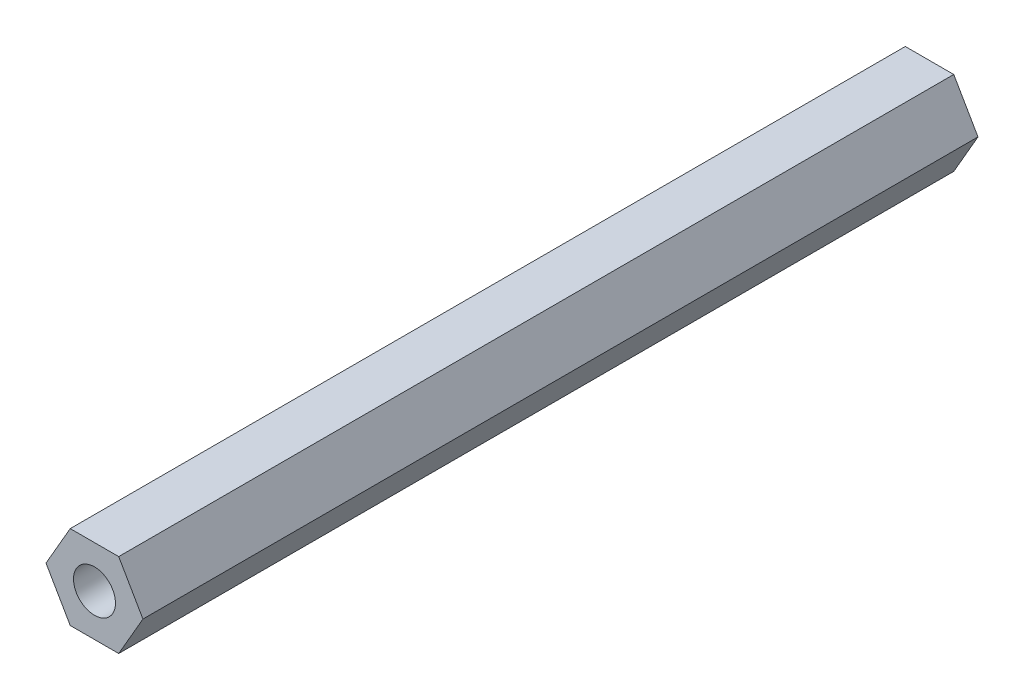
ISO-10303-21;
HEADER;
FILE_DESCRIPTION(('STEP AP214'),'2;1');
FILE_NAME('part.step','',(''),(''),'','','');
FILE_SCHEMA(('AUTOMOTIVE_DESIGN { 1 0 10303 214 1 1 1 1 }'));
ENDSEC;
DATA;
#1=APPLICATION_CONTEXT('core data for automotive mechanical design processes');
#2=APPLICATION_PROTOCOL_DEFINITION('international standard','automotive_design',2000,#1);
#3=PRODUCT_CONTEXT('',#1,'mechanical');
#4=PRODUCT('Part','Part','',(#3));
#5=PRODUCT_RELATED_PRODUCT_CATEGORY('part','',(#4));
#6=PRODUCT_DEFINITION_FORMATION('','',#4);
#7=PRODUCT_DEFINITION_CONTEXT('part definition',#1,'design');
#8=PRODUCT_DEFINITION('design','',#6,#7);
#9=PRODUCT_DEFINITION_SHAPE('','',#8);
#10=(LENGTH_UNIT() NAMED_UNIT(*) SI_UNIT(.MILLI.,.METRE.));
#11=(NAMED_UNIT(*) PLANE_ANGLE_UNIT() SI_UNIT($,.RADIAN.));
#12=(NAMED_UNIT(*) SI_UNIT($,.STERADIAN.) SOLID_ANGLE_UNIT());
#13=UNCERTAINTY_MEASURE_WITH_UNIT(LENGTH_MEASURE(1.E-05),#10,'distance_accuracy_value','');
#14=(GEOMETRIC_REPRESENTATION_CONTEXT(3) GLOBAL_UNCERTAINTY_ASSIGNED_CONTEXT((#13)) GLOBAL_UNIT_ASSIGNED_CONTEXT((#10,
#11,#12)) REPRESENTATION_CONTEXT('',''));
#15=CARTESIAN_POINT('',(0.,0.,0.));
#16=DIRECTION('',(0.,0.,1.));
#17=DIRECTION('',(1.,0.,0.));
#18=AXIS2_PLACEMENT_3D('',#15,#16,#17);
#19=CARTESIAN_POINT('',(0.,0.,126.3269));
#20=DIRECTION('',(0.,0.,1.));
#21=DIRECTION('',(1.,0.,0.));
#22=AXIS2_PLACEMENT_3D('',#19,#20,#21);
#23=PLANE('',#22);
#24=DIRECTION('',(-0.5,0.866025403784439,0.));
#25=VECTOR('',#24,1.);
#26=CARTESIAN_POINT('',(7.33234841870825,0.,126.3269));
#27=LINE('',#26,#25);
#28=CARTESIAN_POINT('',(7.33234841870825,0.,126.3269));
#29=VERTEX_POINT('',#28);
#30=CARTESIAN_POINT('',(3.66617420935413,6.35,126.3269));
#31=VERTEX_POINT('',#30);
#32=EDGE_CURVE('E146',#29,#31,#27,.T.);
#33=ORIENTED_EDGE('',*,*,#32,.T.);
#34=DIRECTION('',(-1.,0.,0.));
#35=VECTOR('',#34,1.);
#36=CARTESIAN_POINT('',(3.66617420935413,6.35,126.3269));
#37=LINE('',#36,#35);
#38=CARTESIAN_POINT('',(-3.66617420935412,6.35,126.3269));
#39=VERTEX_POINT('',#38);
#40=EDGE_CURVE('E94',#31,#39,#37,.T.);
#41=ORIENTED_EDGE('',*,*,#40,.T.);
#42=DIRECTION('',(-0.5,-0.866025403784438,0.));
#43=VECTOR('',#42,1.);
#44=CARTESIAN_POINT('',(-3.66617420935412,6.35,126.3269));
#45=LINE('',#44,#43);
#46=CARTESIAN_POINT('',(-7.33234841870825,0.,126.3269));
#47=VERTEX_POINT('',#46);
#48=EDGE_CURVE('E107',#39,#47,#45,.T.);
#49=ORIENTED_EDGE('',*,*,#48,.T.);
#50=DIRECTION('',(0.5,-0.866025403784439,0.));
#51=VECTOR('',#50,1.);
#52=CARTESIAN_POINT('',(-7.33234841870825,0.,126.3269));
#53=LINE('',#52,#51);
#54=CARTESIAN_POINT('',(-3.66617420935413,-6.35,126.3269));
#55=VERTEX_POINT('',#54);
#56=EDGE_CURVE('E101',#47,#55,#53,.T.);
#57=ORIENTED_EDGE('',*,*,#56,.T.);
#58=DIRECTION('',(1.,0.,0.));
#59=VECTOR('',#58,1.);
#60=CARTESIAN_POINT('',(-3.66617420935413,-6.35,126.3269));
#61=LINE('',#60,#59);
#62=CARTESIAN_POINT('',(3.66617420935412,-6.35,126.3269));
#63=VERTEX_POINT('',#62);
#64=EDGE_CURVE('E105',#55,#63,#61,.T.);
#65=ORIENTED_EDGE('',*,*,#64,.T.);
#66=DIRECTION('',(0.5,0.866025403784438,0.));
#67=VECTOR('',#66,1.);
#68=CARTESIAN_POINT('',(3.66617420935412,-6.35,126.3269));
#69=LINE('',#68,#67);
#70=EDGE_CURVE('E57',#63,#29,#69,.T.);
#71=ORIENTED_EDGE('',*,*,#70,.T.);
#72=EDGE_LOOP('',(#33,#41,#49,#57,#65,#71));
#73=FACE_BOUND('',#72,.T.);
#74=CARTESIAN_POINT('',(0.,0.,126.3269));
#75=DIRECTION('',(0.,0.,1.));
#76=DIRECTION('',(1.,0.,0.));
#77=AXIS2_PLACEMENT_3D('',#74,#75,#76);
#78=CIRCLE('',#77,3.175);
#79=CARTESIAN_POINT('',(3.175,0.,126.3269));
#80=VERTEX_POINT('',#79);
#81=EDGE_CURVE('E134',#80,#80,#78,.T.);
#82=ORIENTED_EDGE('',*,*,#81,.F.);
#83=EDGE_LOOP('',(#82));
#84=FACE_BOUND('',#83,.T.);
#85=ADVANCED_FACE('F39',(#73,#84),#23,.T.);
#86=CARTESIAN_POINT('',(0.,0.,0.));
#87=DIRECTION('',(0.,0.,1.));
#88=DIRECTION('',(1.,0.,0.));
#89=AXIS2_PLACEMENT_3D('',#86,#87,#88);
#90=PLANE('',#89);
#91=DIRECTION('',(-0.5,0.866025403784439,0.));
#92=VECTOR('',#91,1.);
#93=CARTESIAN_POINT('',(7.33234841870825,0.,0.));
#94=LINE('',#93,#92);
#95=CARTESIAN_POINT('',(7.33234841870825,0.,0.));
#96=VERTEX_POINT('',#95);
#97=CARTESIAN_POINT('',(3.66617420935413,6.35,0.));
#98=VERTEX_POINT('',#97);
#99=EDGE_CURVE('E129',#96,#98,#94,.T.);
#100=ORIENTED_EDGE('',*,*,#99,.F.);
#101=DIRECTION('',(0.5,0.866025403784438,0.));
#102=VECTOR('',#101,1.);
#103=CARTESIAN_POINT('',(3.66617420935412,-6.35,0.));
#104=LINE('',#103,#102);
#105=CARTESIAN_POINT('',(3.66617420935412,-6.35,0.));
#106=VERTEX_POINT('',#105);
#107=EDGE_CURVE('E86',#106,#96,#104,.T.);
#108=ORIENTED_EDGE('',*,*,#107,.F.);
#109=DIRECTION('',(1.,0.,0.));
#110=VECTOR('',#109,1.);
#111=CARTESIAN_POINT('',(-3.66617420935413,-6.35,0.));
#112=LINE('',#111,#110);
#113=CARTESIAN_POINT('',(-3.66617420935413,-6.35,0.));
#114=VERTEX_POINT('',#113);
#115=EDGE_CURVE('E80',#114,#106,#112,.T.);
#116=ORIENTED_EDGE('',*,*,#115,.F.);
#117=DIRECTION('',(0.5,-0.866025403784439,0.));
#118=VECTOR('',#117,1.);
#119=CARTESIAN_POINT('',(-7.33234841870825,0.,0.));
#120=LINE('',#119,#118);
#121=CARTESIAN_POINT('',(-7.33234841870825,0.,0.));
#122=VERTEX_POINT('',#121);
#123=EDGE_CURVE('E116',#122,#114,#120,.T.);
#124=ORIENTED_EDGE('',*,*,#123,.F.);
#125=DIRECTION('',(-0.5,-0.866025403784438,0.));
#126=VECTOR('',#125,1.);
#127=CARTESIAN_POINT('',(-3.66617420935412,6.35,0.));
#128=LINE('',#127,#126);
#129=CARTESIAN_POINT('',(-3.66617420935412,6.35,0.));
#130=VERTEX_POINT('',#129);
#131=EDGE_CURVE('E137',#130,#122,#128,.T.);
#132=ORIENTED_EDGE('',*,*,#131,.F.);
#133=DIRECTION('',(-1.,0.,0.));
#134=VECTOR('',#133,1.);
#135=CARTESIAN_POINT('',(3.66617420935413,6.35,0.));
#136=LINE('',#135,#134);
#137=EDGE_CURVE('E133',#98,#130,#136,.T.);
#138=ORIENTED_EDGE('',*,*,#137,.F.);
#139=EDGE_LOOP('',(#100,#108,#116,#124,#132,#138));
#140=FACE_BOUND('',#139,.T.);
#141=CARTESIAN_POINT('',(0.,0.,0.));
#142=DIRECTION('',(0.,0.,1.));
#143=DIRECTION('',(1.,0.,0.));
#144=AXIS2_PLACEMENT_3D('',#141,#142,#143);
#145=CIRCLE('',#144,3.175);
#146=CARTESIAN_POINT('',(3.175,0.,0.));
#147=VERTEX_POINT('',#146);
#148=EDGE_CURVE('E243',#147,#147,#145,.T.);
#149=ORIENTED_EDGE('',*,*,#148,.T.);
#150=EDGE_LOOP('',(#149));
#151=FACE_BOUND('',#150,.T.);
#152=ADVANCED_FACE('F159',(#140,#151),#90,.F.);
#153=CARTESIAN_POINT('',(7.33234841870825,0.,126.3269));
#154=DIRECTION('',(-0.866025403784439,-0.5,0.));
#155=DIRECTION('',(0.5,-0.866025403784439,0.));
#156=AXIS2_PLACEMENT_3D('',#153,#154,#155);
#157=PLANE('',#156);
#158=ORIENTED_EDGE('',*,*,#99,.T.);
#159=DIRECTION('',(0.,0.,-1.));
#160=VECTOR('',#159,1.);
#161=CARTESIAN_POINT('',(3.66617420935413,6.35,126.3269));
#162=LINE('',#161,#160);
#163=EDGE_CURVE('E11',#31,#98,#162,.T.);
#164=ORIENTED_EDGE('',*,*,#163,.F.);
#165=ORIENTED_EDGE('',*,*,#32,.F.);
#166=DIRECTION('',(0.,0.,-1.));
#167=VECTOR('',#166,1.);
#168=CARTESIAN_POINT('',(7.33234841870825,0.,126.3269));
#169=LINE('',#168,#167);
#170=EDGE_CURVE('E125',#29,#96,#169,.T.);
#171=ORIENTED_EDGE('',*,*,#170,.T.);
#172=EDGE_LOOP('',(#158,#164,#165,#171));
#173=FACE_BOUND('',#172,.T.);
#174=ADVANCED_FACE('F41',(#173),#157,.F.);
#175=CARTESIAN_POINT('',(3.66617420935413,6.35,126.3269));
#176=DIRECTION('',(0.,-1.,0.));
#177=DIRECTION('',(1.,0.,0.));
#178=AXIS2_PLACEMENT_3D('',#175,#176,#177);
#179=PLANE('',#178);
#180=ORIENTED_EDGE('',*,*,#137,.T.);
#181=DIRECTION('',(0.,0.,-1.));
#182=VECTOR('',#181,1.);
#183=CARTESIAN_POINT('',(-3.66617420935412,6.35,126.3269));
#184=LINE('',#183,#182);
#185=EDGE_CURVE('E49',#39,#130,#184,.T.);
#186=ORIENTED_EDGE('',*,*,#185,.F.);
#187=ORIENTED_EDGE('',*,*,#40,.F.);
#188=ORIENTED_EDGE('',*,*,#163,.T.);
#189=EDGE_LOOP('',(#180,#186,#187,#188));
#190=FACE_BOUND('',#189,.T.);
#191=ADVANCED_FACE('F184',(#190),#179,.F.);
#192=CARTESIAN_POINT('',(-3.66617420935412,6.35,126.3269));
#193=DIRECTION('',(0.866025403784438,-0.5,0.));
#194=DIRECTION('',(0.5,0.866025403784439,0.));
#195=AXIS2_PLACEMENT_3D('',#192,#193,#194);
#196=PLANE('',#195);
#197=ORIENTED_EDGE('',*,*,#131,.T.);
#198=DIRECTION('',(0.,0.,-1.));
#199=VECTOR('',#198,1.);
#200=CARTESIAN_POINT('',(-7.33234841870825,0.,126.3269));
#201=LINE('',#200,#199);
#202=EDGE_CURVE('E118',#47,#122,#201,.T.);
#203=ORIENTED_EDGE('',*,*,#202,.F.);
#204=ORIENTED_EDGE('',*,*,#48,.F.);
#205=ORIENTED_EDGE('',*,*,#185,.T.);
#206=EDGE_LOOP('',(#197,#203,#204,#205));
#207=FACE_BOUND('',#206,.T.);
#208=ADVANCED_FACE('F156',(#207),#196,.F.);
#209=CARTESIAN_POINT('',(-7.33234841870825,0.,126.3269));
#210=DIRECTION('',(0.866025403784439,0.5,0.));
#211=DIRECTION('',(-0.5,0.866025403784439,0.));
#212=AXIS2_PLACEMENT_3D('',#209,#210,#211);
#213=PLANE('',#212);
#214=ORIENTED_EDGE('',*,*,#123,.T.);
#215=DIRECTION('',(0.,0.,-1.));
#216=VECTOR('',#215,1.);
#217=CARTESIAN_POINT('',(-3.66617420935413,-6.35,126.3269));
#218=LINE('',#217,#216);
#219=EDGE_CURVE('E113',#55,#114,#218,.T.);
#220=ORIENTED_EDGE('',*,*,#219,.F.);
#221=ORIENTED_EDGE('',*,*,#56,.F.);
#222=ORIENTED_EDGE('',*,*,#202,.T.);
#223=EDGE_LOOP('',(#214,#220,#221,#222));
#224=FACE_BOUND('',#223,.T.);
#225=ADVANCED_FACE('F114',(#224),#213,.F.);
#226=CARTESIAN_POINT('',(-3.66617420935413,-6.35,126.3269));
#227=DIRECTION('',(0.,1.,0.));
#228=DIRECTION('',(-1.,0.,0.));
#229=AXIS2_PLACEMENT_3D('',#226,#227,#228);
#230=PLANE('',#229);
#231=ORIENTED_EDGE('',*,*,#115,.T.);
#232=DIRECTION('',(0.,0.,-1.));
#233=VECTOR('',#232,1.);
#234=CARTESIAN_POINT('',(3.66617420935412,-6.35,126.3269));
#235=LINE('',#234,#233);
#236=EDGE_CURVE('E119',#63,#106,#235,.T.);
#237=ORIENTED_EDGE('',*,*,#236,.F.);
#238=ORIENTED_EDGE('',*,*,#64,.F.);
#239=ORIENTED_EDGE('',*,*,#219,.T.);
#240=EDGE_LOOP('',(#231,#237,#238,#239));
#241=FACE_BOUND('',#240,.T.);
#242=ADVANCED_FACE('F121',(#241),#230,.F.);
#243=CARTESIAN_POINT('',(3.66617420935412,-6.35,126.3269));
#244=DIRECTION('',(-0.866025403784438,0.5,0.));
#245=DIRECTION('',(-0.5,-0.866025403784438,0.));
#246=AXIS2_PLACEMENT_3D('',#243,#244,#245);
#247=PLANE('',#246);
#248=ORIENTED_EDGE('',*,*,#107,.T.);
#249=ORIENTED_EDGE('',*,*,#170,.F.);
#250=ORIENTED_EDGE('',*,*,#70,.F.);
#251=ORIENTED_EDGE('',*,*,#236,.T.);
#252=EDGE_LOOP('',(#248,#249,#250,#251));
#253=FACE_BOUND('',#252,.T.);
#254=ADVANCED_FACE('F164',(#253),#247,.F.);
#255=CARTESIAN_POINT('',(0.,0.,126.3269));
#256=DIRECTION('',(0.,0.,-1.));
#257=DIRECTION('',(-1.,0.,0.));
#258=AXIS2_PLACEMENT_3D('',#255,#256,#257);
#259=CYLINDRICAL_SURFACE('',#258,3.175);
#260=ORIENTED_EDGE('',*,*,#81,.T.);
#261=EDGE_LOOP('',(#260));
#262=FACE_BOUND('',#261,.T.);
#263=ORIENTED_EDGE('',*,*,#148,.F.);
#264=EDGE_LOOP('',(#263));
#265=FACE_BOUND('',#264,.T.);
#266=ADVANCED_FACE('F166',(#262,#265),#259,.F.);
#267=CLOSED_SHELL('',(#85,#152,#174,#191,#208,#225,#242,#254,#266));
#268=MANIFOLD_SOLID_BREP('B2',#267);
#269=ADVANCED_BREP_SHAPE_REPRESENTATION('',(#18,#268),#14);
#270=SHAPE_DEFINITION_REPRESENTATION(#9,#269);
ENDSEC;
END-ISO-10303-21;
